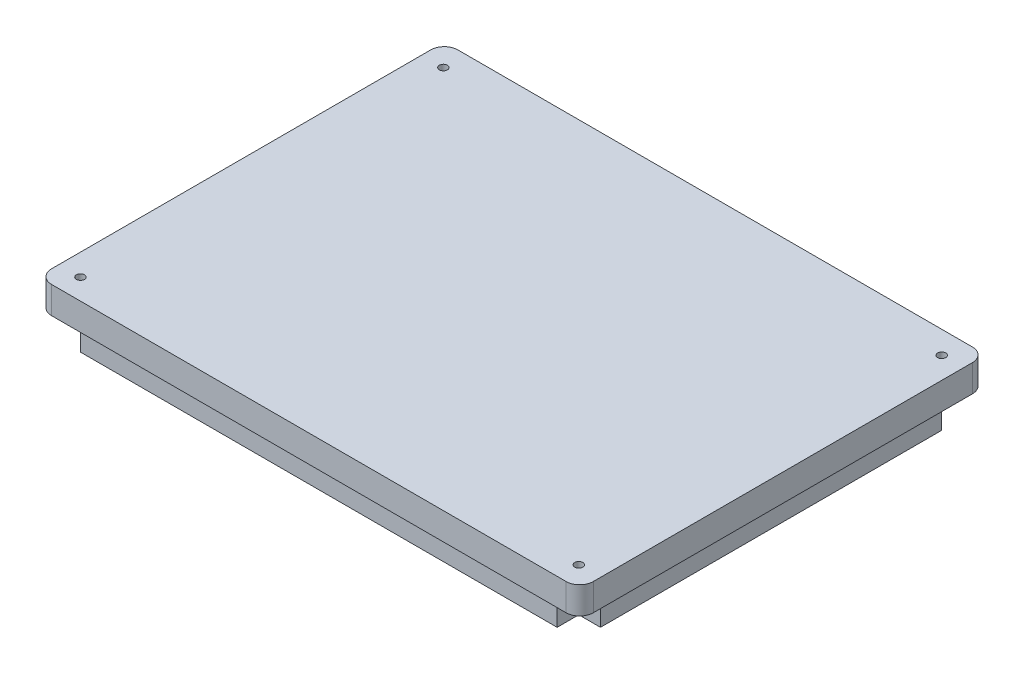
ISO-10303-21;
HEADER;
FILE_DESCRIPTION(('STEP AP214'),'2;1');
FILE_NAME('part.step','',(''),(''),'','','');
FILE_SCHEMA(('AUTOMOTIVE_DESIGN { 1 0 10303 214 1 1 1 1 }'));
ENDSEC;
DATA;
#1=APPLICATION_CONTEXT('core data for automotive mechanical design processes');
#2=APPLICATION_PROTOCOL_DEFINITION('international standard','automotive_design',2000,#1);
#3=PRODUCT_CONTEXT('',#1,'mechanical');
#4=PRODUCT('Part','Part','',(#3));
#5=PRODUCT_RELATED_PRODUCT_CATEGORY('part','',(#4));
#6=PRODUCT_DEFINITION_FORMATION('','',#4);
#7=PRODUCT_DEFINITION_CONTEXT('part definition',#1,'design');
#8=PRODUCT_DEFINITION('design','',#6,#7);
#9=PRODUCT_DEFINITION_SHAPE('','',#8);
#10=(LENGTH_UNIT() NAMED_UNIT(*) SI_UNIT(.MILLI.,.METRE.));
#11=(NAMED_UNIT(*) PLANE_ANGLE_UNIT() SI_UNIT($,.RADIAN.));
#12=(NAMED_UNIT(*) SI_UNIT($,.STERADIAN.) SOLID_ANGLE_UNIT());
#13=UNCERTAINTY_MEASURE_WITH_UNIT(LENGTH_MEASURE(1.E-05),#10,'distance_accuracy_value','');
#14=(GEOMETRIC_REPRESENTATION_CONTEXT(3) GLOBAL_UNCERTAINTY_ASSIGNED_CONTEXT((#13)) GLOBAL_UNIT_ASSIGNED_CONTEXT((#10,
#11,#12)) REPRESENTATION_CONTEXT('',''));
#15=CARTESIAN_POINT('',(0.,0.,0.));
#16=DIRECTION('',(0.,0.,1.));
#17=DIRECTION('',(1.,0.,0.));
#18=AXIS2_PLACEMENT_3D('',#15,#16,#17);
#19=CARTESIAN_POINT('',(-94.9815236537019,10.,-70.2730373092277));
#20=DIRECTION('',(0.,-1.,0.));
#21=DIRECTION('',(0.,0.,-1.));
#22=AXIS2_PLACEMENT_3D('',#19,#20,#21);
#23=CYLINDRICAL_SURFACE('',#22,4.99999999999988);
#24=CARTESIAN_POINT('',(-94.9815236537019,0.,-70.2730373092277));
#25=DIRECTION('',(0.,1.,0.));
#26=DIRECTION('',(0.,0.,1.));
#27=AXIS2_PLACEMENT_3D('',#24,#25,#26);
#28=CIRCLE('',#27,4.99999999999988);
#29=CARTESIAN_POINT('',(-94.9815236537019,0.,-75.2730373092276));
#30=VERTEX_POINT('',#29);
#31=CARTESIAN_POINT('',(-99.9815236537018,0.,-70.2730373092277));
#32=VERTEX_POINT('',#31);
#33=EDGE_CURVE('E162',#30,#32,#28,.T.);
#34=ORIENTED_EDGE('',*,*,#33,.T.);
#35=DIRECTION('',(0.,-1.,0.));
#36=VECTOR('',#35,1.);
#37=CARTESIAN_POINT('',(-99.9815236537018,10.,-70.2730373092277));
#38=LINE('',#37,#36);
#39=CARTESIAN_POINT('',(-99.9815236537018,10.,-70.2730373092277));
#40=VERTEX_POINT('',#39);
#41=EDGE_CURVE('E11',#40,#32,#38,.T.);
#42=ORIENTED_EDGE('',*,*,#41,.F.);
#43=CARTESIAN_POINT('',(-94.9815236537019,10.,-70.2730373092277));
#44=DIRECTION('',(0.,1.,0.));
#45=DIRECTION('',(0.,0.,1.));
#46=AXIS2_PLACEMENT_3D('',#43,#44,#45);
#47=CIRCLE('',#46,4.99999999999988);
#48=CARTESIAN_POINT('',(-94.9815236537019,10.,-75.2730373092276));
#49=VERTEX_POINT('',#48);
#50=EDGE_CURVE('E190',#49,#40,#47,.T.);
#51=ORIENTED_EDGE('',*,*,#50,.F.);
#52=DIRECTION('',(0.,-1.,0.));
#53=VECTOR('',#52,1.);
#54=CARTESIAN_POINT('',(-94.9815236537019,10.,-75.2730373092276));
#55=LINE('',#54,#53);
#56=EDGE_CURVE('E71',#49,#30,#55,.T.);
#57=ORIENTED_EDGE('',*,*,#56,.T.);
#58=EDGE_LOOP('',(#34,#42,#51,#57));
#59=FACE_BOUND('',#58,.T.);
#60=ADVANCED_FACE('F47',(#59),#23,.T.);
#61=CARTESIAN_POINT('',(-99.9815236537018,10.,-70.2730373092277));
#62=DIRECTION('',(1.,0.,0.));
#63=DIRECTION('',(0.,0.,-1.));
#64=AXIS2_PLACEMENT_3D('',#61,#62,#63);
#65=PLANE('',#64);
#66=DIRECTION('',(0.,0.,1.));
#67=VECTOR('',#66,1.);
#68=CARTESIAN_POINT('',(-99.9815236537018,0.,-70.2730373092277));
#69=LINE('',#68,#67);
#70=CARTESIAN_POINT('',(-99.9815236537018,0.,69.7269626907724));
#71=VERTEX_POINT('',#70);
#72=EDGE_CURVE('E165',#32,#71,#69,.T.);
#73=ORIENTED_EDGE('',*,*,#72,.T.);
#74=DIRECTION('',(0.,-1.,0.));
#75=VECTOR('',#74,1.);
#76=CARTESIAN_POINT('',(-99.9815236537018,10.,69.7269626907724));
#77=LINE('',#76,#75);
#78=CARTESIAN_POINT('',(-99.9815236537018,10.,69.7269626907724));
#79=VERTEX_POINT('',#78);
#80=EDGE_CURVE('E55',#79,#71,#77,.T.);
#81=ORIENTED_EDGE('',*,*,#80,.F.);
#82=DIRECTION('',(0.,0.,1.));
#83=VECTOR('',#82,1.);
#84=CARTESIAN_POINT('',(-99.9815236537018,10.,-70.2730373092277));
#85=LINE('',#84,#83);
#86=EDGE_CURVE('E110',#40,#79,#85,.T.);
#87=ORIENTED_EDGE('',*,*,#86,.F.);
#88=ORIENTED_EDGE('',*,*,#41,.T.);
#89=EDGE_LOOP('',(#73,#81,#87,#88));
#90=FACE_BOUND('',#89,.T.);
#91=ADVANCED_FACE('F518',(#90),#65,.F.);
#92=CARTESIAN_POINT('',(-94.9815236537018,10.,69.7269626907724));
#93=DIRECTION('',(0.,-1.,0.));
#94=DIRECTION('',(0.,0.,-1.));
#95=AXIS2_PLACEMENT_3D('',#92,#93,#94);
#96=CYLINDRICAL_SURFACE('',#95,4.99999999999992);
#97=CARTESIAN_POINT('',(-94.9815236537018,0.,69.7269626907724));
#98=DIRECTION('',(0.,1.,0.));
#99=DIRECTION('',(0.,0.,1.));
#100=AXIS2_PLACEMENT_3D('',#97,#98,#99);
#101=CIRCLE('',#100,4.99999999999992);
#102=CARTESIAN_POINT('',(-94.9815236537018,0.,74.7269626907723));
#103=VERTEX_POINT('',#102);
#104=EDGE_CURVE('E169',#71,#103,#101,.T.);
#105=ORIENTED_EDGE('',*,*,#104,.T.);
#106=DIRECTION('',(0.,-1.,0.));
#107=VECTOR('',#106,1.);
#108=CARTESIAN_POINT('',(-94.9815236537018,10.,74.7269626907723));
#109=LINE('',#108,#107);
#110=CARTESIAN_POINT('',(-94.9815236537018,10.,74.7269626907723));
#111=VERTEX_POINT('',#110);
#112=EDGE_CURVE('E200',#111,#103,#109,.T.);
#113=ORIENTED_EDGE('',*,*,#112,.F.);
#114=CARTESIAN_POINT('',(-94.9815236537018,10.,69.7269626907724));
#115=DIRECTION('',(0.,1.,0.));
#116=DIRECTION('',(0.,0.,1.));
#117=AXIS2_PLACEMENT_3D('',#114,#115,#116);
#118=CIRCLE('',#117,4.99999999999992);
#119=EDGE_CURVE('E209',#79,#111,#118,.T.);
#120=ORIENTED_EDGE('',*,*,#119,.F.);
#121=ORIENTED_EDGE('',*,*,#80,.T.);
#122=EDGE_LOOP('',(#105,#113,#120,#121));
#123=FACE_BOUND('',#122,.T.);
#124=ADVANCED_FACE('F207',(#123),#96,.T.);
#125=CARTESIAN_POINT('',(95.0184763462984,10.,74.7269626907723));
#126=DIRECTION('',(0.,0.,1.));
#127=DIRECTION('',(1.,0.,0.));
#128=AXIS2_PLACEMENT_3D('',#125,#126,#127);
#129=PLANE('',#128);
#130=DIRECTION('',(-1.,0.,0.));
#131=VECTOR('',#130,1.);
#132=CARTESIAN_POINT('',(95.0184763462984,0.,74.7269626907723));
#133=LINE('',#132,#131);
#134=CARTESIAN_POINT('',(95.0184763462984,0.,74.7269626907723));
#135=VERTEX_POINT('',#134);
#136=EDGE_CURVE('E173',#135,#103,#133,.T.);
#137=ORIENTED_EDGE('',*,*,#136,.F.);
#138=DIRECTION('',(0.,-1.,0.));
#139=VECTOR('',#138,1.);
#140=CARTESIAN_POINT('',(95.0184763462984,10.,74.7269626907723));
#141=LINE('',#140,#139);
#142=CARTESIAN_POINT('',(95.0184763462984,10.,74.7269626907723));
#143=VERTEX_POINT('',#142);
#144=EDGE_CURVE('E197',#143,#135,#141,.T.);
#145=ORIENTED_EDGE('',*,*,#144,.F.);
#146=DIRECTION('',(-1.,0.,0.));
#147=VECTOR('',#146,1.);
#148=CARTESIAN_POINT('',(95.0184763462984,10.,74.7269626907723));
#149=LINE('',#148,#147);
#150=EDGE_CURVE('E217',#143,#111,#149,.T.);
#151=ORIENTED_EDGE('',*,*,#150,.T.);
#152=ORIENTED_EDGE('',*,*,#112,.T.);
#153=EDGE_LOOP('',(#137,#145,#151,#152));
#154=FACE_BOUND('',#153,.T.);
#155=ADVANCED_FACE('F215',(#154),#129,.T.);
#156=CARTESIAN_POINT('',(95.0184763462984,10.,69.7269626907724));
#157=DIRECTION('',(0.,-1.,0.));
#158=DIRECTION('',(0.,0.,-1.));
#159=AXIS2_PLACEMENT_3D('',#156,#157,#158);
#160=CYLINDRICAL_SURFACE('',#159,4.99999999999987);
#161=CARTESIAN_POINT('',(95.0184763462984,0.,69.7269626907724));
#162=DIRECTION('',(0.,1.,0.));
#163=DIRECTION('',(0.,0.,1.));
#164=AXIS2_PLACEMENT_3D('',#161,#162,#163);
#165=CIRCLE('',#164,4.99999999999987);
#166=CARTESIAN_POINT('',(100.018476346298,0.,69.7269626907724));
#167=VERTEX_POINT('',#166);
#168=EDGE_CURVE('E177',#135,#167,#165,.T.);
#169=ORIENTED_EDGE('',*,*,#168,.T.);
#170=DIRECTION('',(0.,-1.,0.));
#171=VECTOR('',#170,1.);
#172=CARTESIAN_POINT('',(100.018476346298,10.,69.7269626907724));
#173=LINE('',#172,#171);
#174=CARTESIAN_POINT('',(100.018476346298,10.,69.7269626907724));
#175=VERTEX_POINT('',#174);
#176=EDGE_CURVE('E140',#175,#167,#173,.T.);
#177=ORIENTED_EDGE('',*,*,#176,.F.);
#178=CARTESIAN_POINT('',(95.0184763462984,10.,69.7269626907724));
#179=DIRECTION('',(0.,1.,0.));
#180=DIRECTION('',(0.,0.,1.));
#181=AXIS2_PLACEMENT_3D('',#178,#179,#180);
#182=CIRCLE('',#181,4.99999999999987);
#183=EDGE_CURVE('E150',#143,#175,#182,.T.);
#184=ORIENTED_EDGE('',*,*,#183,.F.);
#185=ORIENTED_EDGE('',*,*,#144,.T.);
#186=EDGE_LOOP('',(#169,#177,#184,#185));
#187=FACE_BOUND('',#186,.T.);
#188=ADVANCED_FACE('F537',(#187),#160,.T.);
#189=CARTESIAN_POINT('',(100.018476346298,10.,-70.2730373092277));
#190=DIRECTION('',(1.,0.,0.));
#191=DIRECTION('',(0.,0.,-1.));
#192=AXIS2_PLACEMENT_3D('',#189,#190,#191);
#193=PLANE('',#192);
#194=DIRECTION('',(0.,0.,1.));
#195=VECTOR('',#194,1.);
#196=CARTESIAN_POINT('',(100.018476346298,0.,-70.2730373092277));
#197=LINE('',#196,#195);
#198=CARTESIAN_POINT('',(100.018476346298,0.,-70.2730373092277));
#199=VERTEX_POINT('',#198);
#200=EDGE_CURVE('E134',#199,#167,#197,.T.);
#201=ORIENTED_EDGE('',*,*,#200,.F.);
#202=DIRECTION('',(0.,-1.,0.));
#203=VECTOR('',#202,1.);
#204=CARTESIAN_POINT('',(100.018476346298,10.,-70.2730373092277));
#205=LINE('',#204,#203);
#206=CARTESIAN_POINT('',(100.018476346298,10.,-70.2730373092277));
#207=VERTEX_POINT('',#206);
#208=EDGE_CURVE('E129',#207,#199,#205,.T.);
#209=ORIENTED_EDGE('',*,*,#208,.F.);
#210=DIRECTION('',(0.,0.,1.));
#211=VECTOR('',#210,1.);
#212=CARTESIAN_POINT('',(100.018476346298,10.,-70.2730373092277));
#213=LINE('',#212,#211);
#214=EDGE_CURVE('E132',#207,#175,#213,.T.);
#215=ORIENTED_EDGE('',*,*,#214,.T.);
#216=ORIENTED_EDGE('',*,*,#176,.T.);
#217=EDGE_LOOP('',(#201,#209,#215,#216));
#218=FACE_BOUND('',#217,.T.);
#219=ADVANCED_FACE('F131',(#218),#193,.T.);
#220=CARTESIAN_POINT('',(95.0184763462984,10.,-70.2730373092277));
#221=DIRECTION('',(0.,-1.,0.));
#222=DIRECTION('',(0.,0.,-1.));
#223=AXIS2_PLACEMENT_3D('',#220,#221,#222);
#224=CYLINDRICAL_SURFACE('',#223,4.9999999999999);
#225=CARTESIAN_POINT('',(95.0184763462984,0.,-70.2730373092277));
#226=DIRECTION('',(0.,-1.,0.));
#227=DIRECTION('',(0.,0.,-1.));
#228=AXIS2_PLACEMENT_3D('',#225,#226,#227);
#229=CIRCLE('',#228,4.9999999999999);
#230=CARTESIAN_POINT('',(95.0184763462984,0.,-75.2730373092276));
#231=VERTEX_POINT('',#230);
#232=EDGE_CURVE('E183',#231,#199,#229,.T.);
#233=ORIENTED_EDGE('',*,*,#232,.F.);
#234=DIRECTION('',(0.,-1.,0.));
#235=VECTOR('',#234,1.);
#236=CARTESIAN_POINT('',(95.0184763462984,10.,-75.2730373092276));
#237=LINE('',#236,#235);
#238=CARTESIAN_POINT('',(95.0184763462984,10.,-75.2730373092276));
#239=VERTEX_POINT('',#238);
#240=EDGE_CURVE('E141',#239,#231,#237,.T.);
#241=ORIENTED_EDGE('',*,*,#240,.F.);
#242=CARTESIAN_POINT('',(95.0184763462984,10.,-70.2730373092277));
#243=DIRECTION('',(0.,-1.,0.));
#244=DIRECTION('',(0.,0.,-1.));
#245=AXIS2_PLACEMENT_3D('',#242,#243,#244);
#246=CIRCLE('',#245,4.9999999999999);
#247=EDGE_CURVE('E147',#239,#207,#246,.T.);
#248=ORIENTED_EDGE('',*,*,#247,.T.);
#249=ORIENTED_EDGE('',*,*,#208,.T.);
#250=EDGE_LOOP('',(#233,#241,#248,#249));
#251=FACE_BOUND('',#250,.T.);
#252=ADVANCED_FACE('F154',(#251),#224,.T.);
#253=CARTESIAN_POINT('',(-94.9815236537019,10.,-75.2730373092276));
#254=DIRECTION('',(0.,0.,-1.));
#255=DIRECTION('',(-1.,0.,0.));
#256=AXIS2_PLACEMENT_3D('',#253,#254,#255);
#257=PLANE('',#256);
#258=DIRECTION('',(1.,0.,0.));
#259=VECTOR('',#258,1.);
#260=CARTESIAN_POINT('',(-94.9815236537019,0.,-75.2730373092276));
#261=LINE('',#260,#259);
#262=EDGE_CURVE('E186',#30,#231,#261,.T.);
#263=ORIENTED_EDGE('',*,*,#262,.F.);
#264=ORIENTED_EDGE('',*,*,#56,.F.);
#265=DIRECTION('',(1.,0.,0.));
#266=VECTOR('',#265,1.);
#267=CARTESIAN_POINT('',(-94.9815236537019,10.,-75.2730373092276));
#268=LINE('',#267,#266);
#269=EDGE_CURVE('E156',#49,#239,#268,.T.);
#270=ORIENTED_EDGE('',*,*,#269,.T.);
#271=ORIENTED_EDGE('',*,*,#240,.T.);
#272=EDGE_LOOP('',(#263,#264,#270,#271));
#273=FACE_BOUND('',#272,.T.);
#274=ADVANCED_FACE('F523',(#273),#257,.T.);
#275=CARTESIAN_POINT('',(-94.9815236537019,10.,-70.2730373092277));
#276=DIRECTION('',(0.,1.,0.));
#277=DIRECTION('',(0.,0.,1.));
#278=AXIS2_PLACEMENT_3D('',#275,#276,#277);
#279=PLANE('',#278);
#280=CARTESIAN_POINT('',(92.,10.,-66.956240240479));
#281=DIRECTION('',(0.,1.,0.));
#282=DIRECTION('',(0.,0.,1.));
#283=AXIS2_PLACEMENT_3D('',#280,#281,#282);
#284=CIRCLE('',#283,1.5);
#285=CARTESIAN_POINT('',(92.,10.,-65.456240240479));
#286=VERTEX_POINT('',#285);
#287=EDGE_CURVE('E321',#286,#286,#284,.T.);
#288=ORIENTED_EDGE('',*,*,#287,.F.);
#289=EDGE_LOOP('',(#288));
#290=FACE_BOUND('',#289,.T.);
#291=CARTESIAN_POINT('',(92.,10.,67.0437597595209));
#292=DIRECTION('',(0.,1.,0.));
#293=DIRECTION('',(0.,0.,1.));
#294=AXIS2_PLACEMENT_3D('',#291,#292,#293);
#295=CIRCLE('',#294,1.5);
#296=CARTESIAN_POINT('',(92.,10.,68.5437597595209));
#297=VERTEX_POINT('',#296);
#298=EDGE_CURVE('E371',#297,#297,#295,.T.);
#299=ORIENTED_EDGE('',*,*,#298,.F.);
#300=EDGE_LOOP('',(#299));
#301=FACE_BOUND('',#300,.T.);
#302=CARTESIAN_POINT('',(-92.,10.,67.0437597595209));
#303=DIRECTION('',(0.,1.,0.));
#304=DIRECTION('',(0.,0.,1.));
#305=AXIS2_PLACEMENT_3D('',#302,#303,#304);
#306=CIRCLE('',#305,1.5);
#307=CARTESIAN_POINT('',(-92.,10.,68.5437597595209));
#308=VERTEX_POINT('',#307);
#309=EDGE_CURVE('E375',#308,#308,#306,.T.);
#310=ORIENTED_EDGE('',*,*,#309,.F.);
#311=EDGE_LOOP('',(#310));
#312=FACE_BOUND('',#311,.T.);
#313=CARTESIAN_POINT('',(-92.,10.,-66.956240240479));
#314=DIRECTION('',(0.,1.,0.));
#315=DIRECTION('',(0.,0.,1.));
#316=AXIS2_PLACEMENT_3D('',#313,#314,#315);
#317=CIRCLE('',#316,1.5);
#318=CARTESIAN_POINT('',(-92.,10.,-65.456240240479));
#319=VERTEX_POINT('',#318);
#320=EDGE_CURVE('E379',#319,#319,#317,.T.);
#321=ORIENTED_EDGE('',*,*,#320,.F.);
#322=EDGE_LOOP('',(#321));
#323=FACE_BOUND('',#322,.T.);
#324=ORIENTED_EDGE('',*,*,#50,.T.);
#325=ORIENTED_EDGE('',*,*,#86,.T.);
#326=ORIENTED_EDGE('',*,*,#119,.T.);
#327=ORIENTED_EDGE('',*,*,#150,.F.);
#328=ORIENTED_EDGE('',*,*,#183,.T.);
#329=ORIENTED_EDGE('',*,*,#214,.F.);
#330=ORIENTED_EDGE('',*,*,#247,.F.);
#331=ORIENTED_EDGE('',*,*,#269,.F.);
#332=EDGE_LOOP('',(#324,#325,#326,#327,#328,#329,#330,#331));
#333=FACE_BOUND('',#332,.T.);
#334=ADVANCED_FACE('F145',(#290,#301,#312,#323,#333),#279,.T.);
#335=CARTESIAN_POINT('',(-94.9815236537019,0.,-70.2730373092277));
#336=DIRECTION('',(0.,1.,0.));
#337=DIRECTION('',(0.,0.,1.));
#338=AXIS2_PLACEMENT_3D('',#335,#336,#337);
#339=PLANE('',#338);
#340=CARTESIAN_POINT('',(92.,0.,-66.956240240479));
#341=DIRECTION('',(0.,-1.,0.));
#342=DIRECTION('',(0.,0.,-1.));
#343=AXIS2_PLACEMENT_3D('',#340,#341,#342);
#344=CIRCLE('',#343,1.5);
#345=CARTESIAN_POINT('',(92.,0.,-68.456240240479));
#346=VERTEX_POINT('',#345);
#347=EDGE_CURVE('E388',#346,#346,#344,.T.);
#348=ORIENTED_EDGE('',*,*,#347,.F.);
#349=EDGE_LOOP('',(#348));
#350=FACE_BOUND('',#349,.T.);
#351=CARTESIAN_POINT('',(92.,0.,67.0437597595209));
#352=DIRECTION('',(0.,-1.,0.));
#353=DIRECTION('',(0.,0.,-1.));
#354=AXIS2_PLACEMENT_3D('',#351,#352,#353);
#355=CIRCLE('',#354,1.5);
#356=CARTESIAN_POINT('',(92.,0.,65.5437597595209));
#357=VERTEX_POINT('',#356);
#358=EDGE_CURVE('E392',#357,#357,#355,.T.);
#359=ORIENTED_EDGE('',*,*,#358,.F.);
#360=EDGE_LOOP('',(#359));
#361=FACE_BOUND('',#360,.T.);
#362=CARTESIAN_POINT('',(-92.,0.,67.0437597595209));
#363=DIRECTION('',(0.,-1.,0.));
#364=DIRECTION('',(0.,0.,-1.));
#365=AXIS2_PLACEMENT_3D('',#362,#363,#364);
#366=CIRCLE('',#365,1.5);
#367=CARTESIAN_POINT('',(-92.,0.,65.5437597595209));
#368=VERTEX_POINT('',#367);
#369=EDGE_CURVE('E387',#368,#368,#366,.T.);
#370=ORIENTED_EDGE('',*,*,#369,.F.);
#371=EDGE_LOOP('',(#370));
#372=FACE_BOUND('',#371,.T.);
#373=CARTESIAN_POINT('',(-92.,0.,-66.956240240479));
#374=DIRECTION('',(0.,-1.,0.));
#375=DIRECTION('',(0.,0.,-1.));
#376=AXIS2_PLACEMENT_3D('',#373,#374,#375);
#377=CIRCLE('',#376,1.5);
#378=CARTESIAN_POINT('',(-92.,0.,-68.456240240479));
#379=VERTEX_POINT('',#378);
#380=EDGE_CURVE('E383',#379,#379,#377,.T.);
#381=ORIENTED_EDGE('',*,*,#380,.F.);
#382=EDGE_LOOP('',(#381));
#383=FACE_BOUND('',#382,.T.);
#384=DIRECTION('',(-1.,0.,0.));
#385=VECTOR('',#384,1.);
#386=CARTESIAN_POINT('',(0.,0.,-62.956240240479));
#387=LINE('',#386,#385);
#388=CARTESIAN_POINT('',(-88.,0.,-62.956240240479));
#389=VERTEX_POINT('',#388);
#390=CARTESIAN_POINT('',(-96.,0.,-62.956240240479));
#391=VERTEX_POINT('',#390);
#392=EDGE_CURVE('E315',#389,#391,#387,.T.);
#393=ORIENTED_EDGE('',*,*,#392,.T.);
#394=DIRECTION('',(0.,0.,1.));
#395=VECTOR('',#394,1.);
#396=CARTESIAN_POINT('',(-96.,0.,0.));
#397=LINE('',#396,#395);
#398=CARTESIAN_POINT('',(-96.,0.,63.0437597595209));
#399=VERTEX_POINT('',#398);
#400=EDGE_CURVE('E62',#391,#399,#397,.T.);
#401=ORIENTED_EDGE('',*,*,#400,.T.);
#402=DIRECTION('',(1.,0.,0.));
#403=VECTOR('',#402,1.);
#404=CARTESIAN_POINT('',(0.,0.,63.0437597595209));
#405=LINE('',#404,#403);
#406=CARTESIAN_POINT('',(-88.,0.,63.0437597595209));
#407=VERTEX_POINT('',#406);
#408=EDGE_CURVE('E274',#399,#407,#405,.T.);
#409=ORIENTED_EDGE('',*,*,#408,.T.);
#410=DIRECTION('',(0.,0.,1.));
#411=VECTOR('',#410,1.);
#412=CARTESIAN_POINT('',(-88.,0.,0.));
#413=LINE('',#412,#411);
#414=CARTESIAN_POINT('',(-88.,0.,71.0437597595209));
#415=VERTEX_POINT('',#414);
#416=EDGE_CURVE('E279',#407,#415,#413,.T.);
#417=ORIENTED_EDGE('',*,*,#416,.T.);
#418=DIRECTION('',(1.,0.,0.));
#419=VECTOR('',#418,1.);
#420=CARTESIAN_POINT('',(0.,0.,71.0437597595209));
#421=LINE('',#420,#419);
#422=CARTESIAN_POINT('',(87.9999999999999,0.,71.0437597595209));
#423=VERTEX_POINT('',#422);
#424=EDGE_CURVE('E283',#415,#423,#421,.T.);
#425=ORIENTED_EDGE('',*,*,#424,.T.);
#426=DIRECTION('',(0.,0.,-1.));
#427=VECTOR('',#426,1.);
#428=CARTESIAN_POINT('',(88.0000000000002,0.,3.05311331771918E-13));
#429=LINE('',#428,#427);
#430=CARTESIAN_POINT('',(88.,0.,63.0437597595209));
#431=VERTEX_POINT('',#430);
#432=EDGE_CURVE('E287',#423,#431,#429,.T.);
#433=ORIENTED_EDGE('',*,*,#432,.T.);
#434=DIRECTION('',(1.,0.,0.));
#435=VECTOR('',#434,1.);
#436=CARTESIAN_POINT('',(0.,0.,63.0437597595209));
#437=LINE('',#436,#435);
#438=CARTESIAN_POINT('',(96.,0.,63.0437597595209));
#439=VERTEX_POINT('',#438);
#440=EDGE_CURVE('E291',#431,#439,#437,.T.);
#441=ORIENTED_EDGE('',*,*,#440,.T.);
#442=DIRECTION('',(0.,0.,-1.));
#443=VECTOR('',#442,1.);
#444=CARTESIAN_POINT('',(96.,0.,0.));
#445=LINE('',#444,#443);
#446=CARTESIAN_POINT('',(96.,0.,-62.956240240479));
#447=VERTEX_POINT('',#446);
#448=EDGE_CURVE('E295',#439,#447,#445,.T.);
#449=ORIENTED_EDGE('',*,*,#448,.T.);
#450=DIRECTION('',(-1.,0.,0.));
#451=VECTOR('',#450,1.);
#452=CARTESIAN_POINT('',(0.,0.,-62.956240240479));
#453=LINE('',#452,#451);
#454=CARTESIAN_POINT('',(88.,0.,-62.956240240479));
#455=VERTEX_POINT('',#454);
#456=EDGE_CURVE('E299',#447,#455,#453,.T.);
#457=ORIENTED_EDGE('',*,*,#456,.T.);
#458=DIRECTION('',(0.,0.,-1.));
#459=VECTOR('',#458,1.);
#460=CARTESIAN_POINT('',(88.,0.,0.));
#461=LINE('',#460,#459);
#462=CARTESIAN_POINT('',(88.,0.,-70.956240240479));
#463=VERTEX_POINT('',#462);
#464=EDGE_CURVE('E303',#455,#463,#461,.T.);
#465=ORIENTED_EDGE('',*,*,#464,.T.);
#466=DIRECTION('',(-1.,0.,0.));
#467=VECTOR('',#466,1.);
#468=CARTESIAN_POINT('',(0.,0.,-70.956240240479));
#469=LINE('',#468,#467);
#470=CARTESIAN_POINT('',(-88.,0.,-70.956240240479));
#471=VERTEX_POINT('',#470);
#472=EDGE_CURVE('E307',#463,#471,#469,.T.);
#473=ORIENTED_EDGE('',*,*,#472,.T.);
#474=DIRECTION('',(0.,0.,1.));
#475=VECTOR('',#474,1.);
#476=CARTESIAN_POINT('',(-88.,0.,0.));
#477=LINE('',#476,#475);
#478=EDGE_CURVE('E311',#471,#389,#477,.T.);
#479=ORIENTED_EDGE('',*,*,#478,.T.);
#480=EDGE_LOOP('',(#393,#401,#409,#417,#425,#433,#441,#449,#457,#465,#473,#479));
#481=FACE_BOUND('',#480,.T.);
#482=ORIENTED_EDGE('',*,*,#33,.F.);
#483=ORIENTED_EDGE('',*,*,#262,.T.);
#484=ORIENTED_EDGE('',*,*,#232,.T.);
#485=ORIENTED_EDGE('',*,*,#200,.T.);
#486=ORIENTED_EDGE('',*,*,#168,.F.);
#487=ORIENTED_EDGE('',*,*,#136,.T.);
#488=ORIENTED_EDGE('',*,*,#104,.F.);
#489=ORIENTED_EDGE('',*,*,#72,.F.);
#490=EDGE_LOOP('',(#482,#483,#484,#485,#486,#487,#488,#489));
#491=FACE_BOUND('',#490,.T.);
#492=ADVANCED_FACE('F211',(#350,#361,#372,#383,#481,#491),#339,.F.);
#493=CARTESIAN_POINT('',(-96.,-10.,0.));
#494=DIRECTION('',(-1.,0.,0.));
#495=DIRECTION('',(0.,0.,1.));
#496=AXIS2_PLACEMENT_3D('',#493,#494,#495);
#497=PLANE('',#496);
#498=ORIENTED_EDGE('',*,*,#400,.F.);
#499=DIRECTION('',(0.,1.,0.));
#500=VECTOR('',#499,1.);
#501=CARTESIAN_POINT('',(-96.,-10.,-62.956240240479));
#502=LINE('',#501,#500);
#503=CARTESIAN_POINT('',(-96.,-10.,-62.956240240479));
#504=VERTEX_POINT('',#503);
#505=EDGE_CURVE('E166',#504,#391,#502,.T.);
#506=ORIENTED_EDGE('',*,*,#505,.F.);
#507=DIRECTION('',(0.,0.,1.));
#508=VECTOR('',#507,1.);
#509=CARTESIAN_POINT('',(-96.,-10.,0.));
#510=LINE('',#509,#508);
#511=CARTESIAN_POINT('',(-96.,-10.,63.0437597595209));
#512=VERTEX_POINT('',#511);
#513=EDGE_CURVE('E278',#504,#512,#510,.T.);
#514=ORIENTED_EDGE('',*,*,#513,.T.);
#515=DIRECTION('',(0.,1.,0.));
#516=VECTOR('',#515,1.);
#517=CARTESIAN_POINT('',(-96.,-10.,63.0437597595209));
#518=LINE('',#517,#516);
#519=EDGE_CURVE('E270',#512,#399,#518,.T.);
#520=ORIENTED_EDGE('',*,*,#519,.T.);
#521=EDGE_LOOP('',(#498,#506,#514,#520));
#522=FACE_BOUND('',#521,.T.);
#523=ADVANCED_FACE('F404',(#522),#497,.T.);
#524=CARTESIAN_POINT('',(0.,-10.,-62.956240240479));
#525=DIRECTION('',(0.,0.,-1.));
#526=DIRECTION('',(-1.,0.,0.));
#527=AXIS2_PLACEMENT_3D('',#524,#525,#526);
#528=PLANE('',#527);
#529=ORIENTED_EDGE('',*,*,#392,.F.);
#530=DIRECTION('',(0.,1.,0.));
#531=VECTOR('',#530,1.);
#532=CARTESIAN_POINT('',(-88.,-10.,-62.956240240479));
#533=LINE('',#532,#531);
#534=CARTESIAN_POINT('',(-88.,-10.,-62.956240240479));
#535=VERTEX_POINT('',#534);
#536=EDGE_CURVE('E230',#535,#389,#533,.T.);
#537=ORIENTED_EDGE('',*,*,#536,.F.);
#538=DIRECTION('',(-1.,0.,0.));
#539=VECTOR('',#538,1.);
#540=CARTESIAN_POINT('',(0.,-10.,-62.956240240479));
#541=LINE('',#540,#539);
#542=EDGE_CURVE('E361',#535,#504,#541,.T.);
#543=ORIENTED_EDGE('',*,*,#542,.T.);
#544=ORIENTED_EDGE('',*,*,#505,.T.);
#545=EDGE_LOOP('',(#529,#537,#543,#544));
#546=FACE_BOUND('',#545,.T.);
#547=ADVANCED_FACE('F414',(#546),#528,.T.);
#548=CARTESIAN_POINT('',(-88.,-10.,0.));
#549=DIRECTION('',(-1.,0.,0.));
#550=DIRECTION('',(0.,0.,1.));
#551=AXIS2_PLACEMENT_3D('',#548,#549,#550);
#552=PLANE('',#551);
#553=ORIENTED_EDGE('',*,*,#478,.F.);
#554=DIRECTION('',(0.,1.,0.));
#555=VECTOR('',#554,1.);
#556=CARTESIAN_POINT('',(-88.,-10.,-70.956240240479));
#557=LINE('',#556,#555);
#558=CARTESIAN_POINT('',(-88.,-10.,-70.956240240479));
#559=VERTEX_POINT('',#558);
#560=EDGE_CURVE('E234',#559,#471,#557,.T.);
#561=ORIENTED_EDGE('',*,*,#560,.F.);
#562=DIRECTION('',(0.,0.,1.));
#563=VECTOR('',#562,1.);
#564=CARTESIAN_POINT('',(-88.,-10.,0.));
#565=LINE('',#564,#563);
#566=EDGE_CURVE('E357',#559,#535,#565,.T.);
#567=ORIENTED_EDGE('',*,*,#566,.T.);
#568=ORIENTED_EDGE('',*,*,#536,.T.);
#569=EDGE_LOOP('',(#553,#561,#567,#568));
#570=FACE_BOUND('',#569,.T.);
#571=ADVANCED_FACE('F508',(#570),#552,.T.);
#572=CARTESIAN_POINT('',(0.,-10.,-70.956240240479));
#573=DIRECTION('',(0.,0.,-1.));
#574=DIRECTION('',(-1.,0.,0.));
#575=AXIS2_PLACEMENT_3D('',#572,#573,#574);
#576=PLANE('',#575);
#577=ORIENTED_EDGE('',*,*,#472,.F.);
#578=DIRECTION('',(0.,1.,0.));
#579=VECTOR('',#578,1.);
#580=CARTESIAN_POINT('',(88.,-10.,-70.956240240479));
#581=LINE('',#580,#579);
#582=CARTESIAN_POINT('',(88.,-10.,-70.956240240479));
#583=VERTEX_POINT('',#582);
#584=EDGE_CURVE('E238',#583,#463,#581,.T.);
#585=ORIENTED_EDGE('',*,*,#584,.F.);
#586=DIRECTION('',(-1.,0.,0.));
#587=VECTOR('',#586,1.);
#588=CARTESIAN_POINT('',(0.,-10.,-70.956240240479));
#589=LINE('',#588,#587);
#590=EDGE_CURVE('E353',#583,#559,#589,.T.);
#591=ORIENTED_EDGE('',*,*,#590,.T.);
#592=ORIENTED_EDGE('',*,*,#560,.T.);
#593=EDGE_LOOP('',(#577,#585,#591,#592));
#594=FACE_BOUND('',#593,.T.);
#595=ADVANCED_FACE('F506',(#594),#576,.T.);
#596=CARTESIAN_POINT('',(88.,-10.,0.));
#597=DIRECTION('',(1.,0.,0.));
#598=DIRECTION('',(0.,0.,-1.));
#599=AXIS2_PLACEMENT_3D('',#596,#597,#598);
#600=PLANE('',#599);
#601=ORIENTED_EDGE('',*,*,#464,.F.);
#602=DIRECTION('',(0.,1.,0.));
#603=VECTOR('',#602,1.);
#604=CARTESIAN_POINT('',(88.,-10.,-62.956240240479));
#605=LINE('',#604,#603);
#606=CARTESIAN_POINT('',(88.,-10.,-62.956240240479));
#607=VERTEX_POINT('',#606);
#608=EDGE_CURVE('E242',#607,#455,#605,.T.);
#609=ORIENTED_EDGE('',*,*,#608,.F.);
#610=DIRECTION('',(0.,0.,-1.));
#611=VECTOR('',#610,1.);
#612=CARTESIAN_POINT('',(88.,-10.,0.));
#613=LINE('',#612,#611);
#614=EDGE_CURVE('E349',#607,#583,#613,.T.);
#615=ORIENTED_EDGE('',*,*,#614,.T.);
#616=ORIENTED_EDGE('',*,*,#584,.T.);
#617=EDGE_LOOP('',(#601,#609,#615,#616));
#618=FACE_BOUND('',#617,.T.);
#619=ADVANCED_FACE('F502',(#618),#600,.T.);
#620=CARTESIAN_POINT('',(0.,-10.,-62.956240240479));
#621=DIRECTION('',(0.,0.,-1.));
#622=DIRECTION('',(-1.,0.,0.));
#623=AXIS2_PLACEMENT_3D('',#620,#621,#622);
#624=PLANE('',#623);
#625=ORIENTED_EDGE('',*,*,#456,.F.);
#626=DIRECTION('',(0.,1.,0.));
#627=VECTOR('',#626,1.);
#628=CARTESIAN_POINT('',(96.,-10.,-62.956240240479));
#629=LINE('',#628,#627);
#630=CARTESIAN_POINT('',(96.,-10.,-62.956240240479));
#631=VERTEX_POINT('',#630);
#632=EDGE_CURVE('E246',#631,#447,#629,.T.);
#633=ORIENTED_EDGE('',*,*,#632,.F.);
#634=DIRECTION('',(-1.,0.,0.));
#635=VECTOR('',#634,1.);
#636=CARTESIAN_POINT('',(0.,-10.,-62.956240240479));
#637=LINE('',#636,#635);
#638=EDGE_CURVE('E345',#631,#607,#637,.T.);
#639=ORIENTED_EDGE('',*,*,#638,.T.);
#640=ORIENTED_EDGE('',*,*,#608,.T.);
#641=EDGE_LOOP('',(#625,#633,#639,#640));
#642=FACE_BOUND('',#641,.T.);
#643=ADVANCED_FACE('F498',(#642),#624,.T.);
#644=CARTESIAN_POINT('',(96.,-10.,0.));
#645=DIRECTION('',(1.,0.,0.));
#646=DIRECTION('',(0.,0.,-1.));
#647=AXIS2_PLACEMENT_3D('',#644,#645,#646);
#648=PLANE('',#647);
#649=ORIENTED_EDGE('',*,*,#448,.F.);
#650=DIRECTION('',(0.,1.,0.));
#651=VECTOR('',#650,1.);
#652=CARTESIAN_POINT('',(96.,-10.,63.0437597595209));
#653=LINE('',#652,#651);
#654=CARTESIAN_POINT('',(96.,-10.,63.0437597595209));
#655=VERTEX_POINT('',#654);
#656=EDGE_CURVE('E250',#655,#439,#653,.T.);
#657=ORIENTED_EDGE('',*,*,#656,.F.);
#658=DIRECTION('',(0.,0.,-1.));
#659=VECTOR('',#658,1.);
#660=CARTESIAN_POINT('',(96.,-10.,0.));
#661=LINE('',#660,#659);
#662=EDGE_CURVE('E341',#655,#631,#661,.T.);
#663=ORIENTED_EDGE('',*,*,#662,.T.);
#664=ORIENTED_EDGE('',*,*,#632,.T.);
#665=EDGE_LOOP('',(#649,#657,#663,#664));
#666=FACE_BOUND('',#665,.T.);
#667=ADVANCED_FACE('F494',(#666),#648,.T.);
#668=CARTESIAN_POINT('',(0.,-10.,63.0437597595209));
#669=DIRECTION('',(0.,0.,1.));
#670=DIRECTION('',(1.,0.,0.));
#671=AXIS2_PLACEMENT_3D('',#668,#669,#670);
#672=PLANE('',#671);
#673=ORIENTED_EDGE('',*,*,#440,.F.);
#674=DIRECTION('',(0.,1.,0.));
#675=VECTOR('',#674,1.);
#676=CARTESIAN_POINT('',(88.,-10.,63.0437597595209));
#677=LINE('',#676,#675);
#678=CARTESIAN_POINT('',(88.,-10.,63.0437597595209));
#679=VERTEX_POINT('',#678);
#680=EDGE_CURVE('E254',#679,#431,#677,.T.);
#681=ORIENTED_EDGE('',*,*,#680,.F.);
#682=DIRECTION('',(1.,0.,0.));
#683=VECTOR('',#682,1.);
#684=CARTESIAN_POINT('',(0.,-10.,63.0437597595209));
#685=LINE('',#684,#683);
#686=EDGE_CURVE('E337',#679,#655,#685,.T.);
#687=ORIENTED_EDGE('',*,*,#686,.T.);
#688=ORIENTED_EDGE('',*,*,#656,.T.);
#689=EDGE_LOOP('',(#673,#681,#687,#688));
#690=FACE_BOUND('',#689,.T.);
#691=ADVANCED_FACE('F490',(#690),#672,.T.);
#692=CARTESIAN_POINT('',(88.0000000000002,-10.,3.05311331771918E-13));
#693=DIRECTION('',(1.,0.,0.));
#694=DIRECTION('',(0.,0.,-1.));
#695=AXIS2_PLACEMENT_3D('',#692,#693,#694);
#696=PLANE('',#695);
#697=ORIENTED_EDGE('',*,*,#432,.F.);
#698=DIRECTION('',(0.,1.,0.));
#699=VECTOR('',#698,1.);
#700=CARTESIAN_POINT('',(87.9999999999999,-10.,71.0437597595209));
#701=LINE('',#700,#699);
#702=CARTESIAN_POINT('',(87.9999999999999,-10.,71.0437597595209));
#703=VERTEX_POINT('',#702);
#704=EDGE_CURVE('E258',#703,#423,#701,.T.);
#705=ORIENTED_EDGE('',*,*,#704,.F.);
#706=DIRECTION('',(0.,0.,-1.));
#707=VECTOR('',#706,1.);
#708=CARTESIAN_POINT('',(88.0000000000002,-10.,3.05311331771918E-13));
#709=LINE('',#708,#707);
#710=EDGE_CURVE('E333',#703,#679,#709,.T.);
#711=ORIENTED_EDGE('',*,*,#710,.T.);
#712=ORIENTED_EDGE('',*,*,#680,.T.);
#713=EDGE_LOOP('',(#697,#705,#711,#712));
#714=FACE_BOUND('',#713,.T.);
#715=ADVANCED_FACE('F487',(#714),#696,.T.);
#716=CARTESIAN_POINT('',(0.,-10.,71.0437597595209));
#717=DIRECTION('',(0.,0.,1.));
#718=DIRECTION('',(1.,0.,0.));
#719=AXIS2_PLACEMENT_3D('',#716,#717,#718);
#720=PLANE('',#719);
#721=ORIENTED_EDGE('',*,*,#424,.F.);
#722=DIRECTION('',(0.,1.,0.));
#723=VECTOR('',#722,1.);
#724=CARTESIAN_POINT('',(-88.,-10.,71.0437597595209));
#725=LINE('',#724,#723);
#726=CARTESIAN_POINT('',(-88.,-10.,71.0437597595209));
#727=VERTEX_POINT('',#726);
#728=EDGE_CURVE('E262',#727,#415,#725,.T.);
#729=ORIENTED_EDGE('',*,*,#728,.F.);
#730=DIRECTION('',(1.,0.,0.));
#731=VECTOR('',#730,1.);
#732=CARTESIAN_POINT('',(0.,-10.,71.0437597595209));
#733=LINE('',#732,#731);
#734=EDGE_CURVE('E329',#727,#703,#733,.T.);
#735=ORIENTED_EDGE('',*,*,#734,.T.);
#736=ORIENTED_EDGE('',*,*,#704,.T.);
#737=EDGE_LOOP('',(#721,#729,#735,#736));
#738=FACE_BOUND('',#737,.T.);
#739=ADVANCED_FACE('F483',(#738),#720,.T.);
#740=CARTESIAN_POINT('',(-88.,-10.,0.));
#741=DIRECTION('',(-1.,0.,0.));
#742=DIRECTION('',(0.,0.,1.));
#743=AXIS2_PLACEMENT_3D('',#740,#741,#742);
#744=PLANE('',#743);
#745=ORIENTED_EDGE('',*,*,#416,.F.);
#746=DIRECTION('',(0.,1.,0.));
#747=VECTOR('',#746,1.);
#748=CARTESIAN_POINT('',(-88.,-10.,63.0437597595209));
#749=LINE('',#748,#747);
#750=CARTESIAN_POINT('',(-88.,-10.,63.0437597595209));
#751=VERTEX_POINT('',#750);
#752=EDGE_CURVE('E266',#751,#407,#749,.T.);
#753=ORIENTED_EDGE('',*,*,#752,.F.);
#754=DIRECTION('',(0.,0.,1.));
#755=VECTOR('',#754,1.);
#756=CARTESIAN_POINT('',(-88.,-10.,0.));
#757=LINE('',#756,#755);
#758=EDGE_CURVE('E325',#751,#727,#757,.T.);
#759=ORIENTED_EDGE('',*,*,#758,.T.);
#760=ORIENTED_EDGE('',*,*,#728,.T.);
#761=EDGE_LOOP('',(#745,#753,#759,#760));
#762=FACE_BOUND('',#761,.T.);
#763=ADVANCED_FACE('F480',(#762),#744,.T.);
#764=CARTESIAN_POINT('',(0.,-10.,63.0437597595209));
#765=DIRECTION('',(0.,0.,1.));
#766=DIRECTION('',(1.,0.,0.));
#767=AXIS2_PLACEMENT_3D('',#764,#765,#766);
#768=PLANE('',#767);
#769=ORIENTED_EDGE('',*,*,#408,.F.);
#770=ORIENTED_EDGE('',*,*,#519,.F.);
#771=DIRECTION('',(1.,0.,0.));
#772=VECTOR('',#771,1.);
#773=CARTESIAN_POINT('',(0.,-10.,63.0437597595209));
#774=LINE('',#773,#772);
#775=EDGE_CURVE('E273',#512,#751,#774,.T.);
#776=ORIENTED_EDGE('',*,*,#775,.T.);
#777=ORIENTED_EDGE('',*,*,#752,.T.);
#778=EDGE_LOOP('',(#769,#770,#776,#777));
#779=FACE_BOUND('',#778,.T.);
#780=ADVANCED_FACE('F474',(#779),#768,.T.);
#781=CARTESIAN_POINT('',(0.,-10.,0.));
#782=DIRECTION('',(0.,-1.,0.));
#783=DIRECTION('',(0.,0.,-1.));
#784=AXIS2_PLACEMENT_3D('',#781,#782,#783);
#785=PLANE('',#784);
#786=ORIENTED_EDGE('',*,*,#513,.F.);
#787=ORIENTED_EDGE('',*,*,#542,.F.);
#788=ORIENTED_EDGE('',*,*,#566,.F.);
#789=ORIENTED_EDGE('',*,*,#590,.F.);
#790=ORIENTED_EDGE('',*,*,#614,.F.);
#791=ORIENTED_EDGE('',*,*,#638,.F.);
#792=ORIENTED_EDGE('',*,*,#662,.F.);
#793=ORIENTED_EDGE('',*,*,#686,.F.);
#794=ORIENTED_EDGE('',*,*,#710,.F.);
#795=ORIENTED_EDGE('',*,*,#734,.F.);
#796=ORIENTED_EDGE('',*,*,#758,.F.);
#797=ORIENTED_EDGE('',*,*,#775,.F.);
#798=EDGE_LOOP('',(#786,#787,#788,#789,#790,#791,#792,#793,#794,#795,#796,#797));
#799=FACE_BOUND('',#798,.T.);
#800=ADVANCED_FACE('F477',(#799),#785,.T.);
#801=CARTESIAN_POINT('',(-92.,15.,-66.956240240479));
#802=DIRECTION('',(0.,-1.,0.));
#803=DIRECTION('',(0.,0.,-1.));
#804=AXIS2_PLACEMENT_3D('',#801,#802,#803);
#805=CYLINDRICAL_SURFACE('',#804,1.5);
#806=ORIENTED_EDGE('',*,*,#320,.T.);
#807=EDGE_LOOP('',(#806));
#808=FACE_BOUND('',#807,.T.);
#809=ORIENTED_EDGE('',*,*,#380,.T.);
#810=EDGE_LOOP('',(#809));
#811=FACE_BOUND('',#810,.T.);
#812=ADVANCED_FACE('F682',(#808,#811),#805,.F.);
#813=CARTESIAN_POINT('',(-92.,15.,67.0437597595209));
#814=DIRECTION('',(0.,-1.,0.));
#815=DIRECTION('',(0.,0.,-1.));
#816=AXIS2_PLACEMENT_3D('',#813,#814,#815);
#817=CYLINDRICAL_SURFACE('',#816,1.5);
#818=ORIENTED_EDGE('',*,*,#309,.T.);
#819=EDGE_LOOP('',(#818));
#820=FACE_BOUND('',#819,.T.);
#821=ORIENTED_EDGE('',*,*,#369,.T.);
#822=EDGE_LOOP('',(#821));
#823=FACE_BOUND('',#822,.T.);
#824=ADVANCED_FACE('F400',(#820,#823),#817,.F.);
#825=CARTESIAN_POINT('',(92.,15.,67.0437597595209));
#826=DIRECTION('',(0.,-1.,0.));
#827=DIRECTION('',(0.,0.,-1.));
#828=AXIS2_PLACEMENT_3D('',#825,#826,#827);
#829=CYLINDRICAL_SURFACE('',#828,1.5);
#830=ORIENTED_EDGE('',*,*,#298,.T.);
#831=EDGE_LOOP('',(#830));
#832=FACE_BOUND('',#831,.T.);
#833=ORIENTED_EDGE('',*,*,#358,.T.);
#834=EDGE_LOOP('',(#833));
#835=FACE_BOUND('',#834,.T.);
#836=ADVANCED_FACE('F699',(#832,#835),#829,.F.);
#837=CARTESIAN_POINT('',(92.,15.,-66.956240240479));
#838=DIRECTION('',(0.,-1.,0.));
#839=DIRECTION('',(0.,0.,-1.));
#840=AXIS2_PLACEMENT_3D('',#837,#838,#839);
#841=CYLINDRICAL_SURFACE('',#840,1.5);
#842=ORIENTED_EDGE('',*,*,#287,.T.);
#843=EDGE_LOOP('',(#842));
#844=FACE_BOUND('',#843,.T.);
#845=ORIENTED_EDGE('',*,*,#347,.T.);
#846=EDGE_LOOP('',(#845));
#847=FACE_BOUND('',#846,.T.);
#848=ADVANCED_FACE('F709',(#844,#847),#841,.F.);
#849=CLOSED_SHELL('',(#60,#91,#124,#155,#188,#219,#252,#274,#334,#492,#523,#547,#571,#595,#619,
#643,#667,#691,#715,#739,#763,#780,#800,#812,#824,#836,#848));
#850=MANIFOLD_SOLID_BREP('B2',#849);
#851=ADVANCED_BREP_SHAPE_REPRESENTATION('',(#18,#850),#14);
#852=SHAPE_DEFINITION_REPRESENTATION(#9,#851);
ENDSEC;
END-ISO-10303-21;
